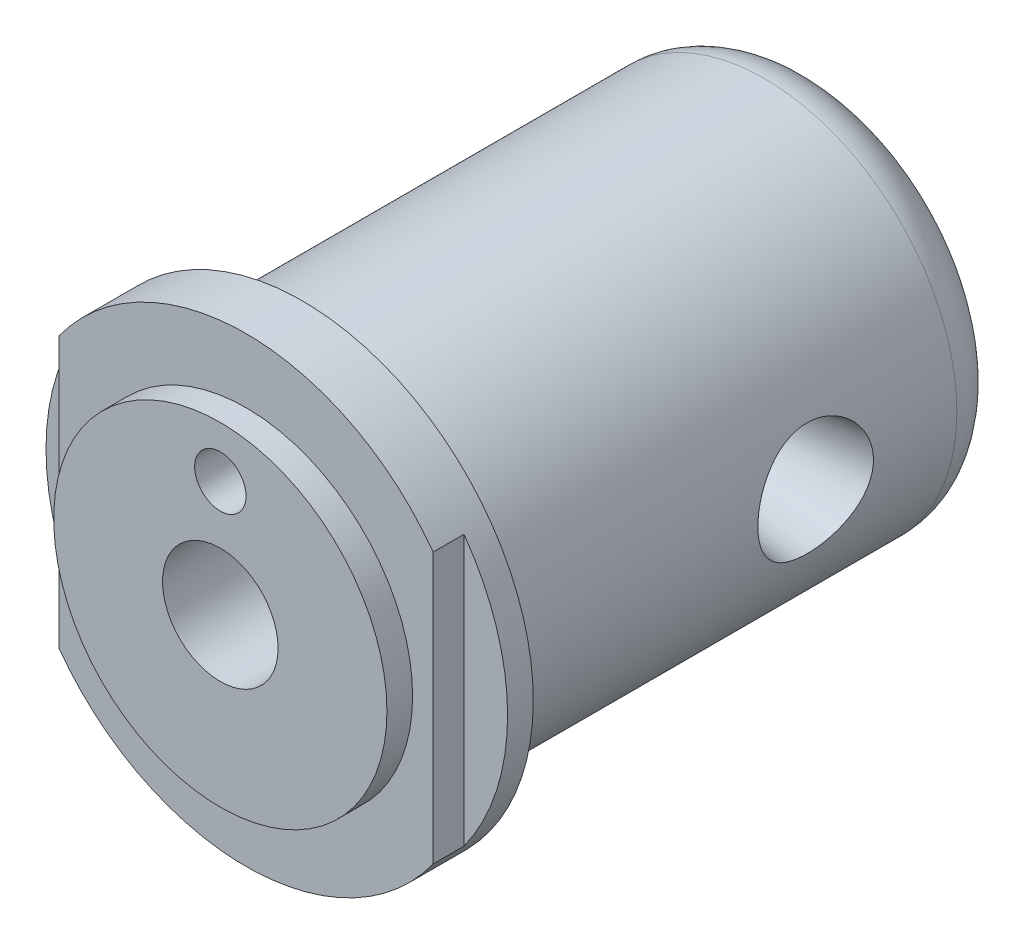
ISO-10303-21;
HEADER;
FILE_DESCRIPTION(('STEP AP214'),'2;1');
FILE_NAME('part.step','',(''),(''),'','','');
FILE_SCHEMA(('AUTOMOTIVE_DESIGN { 1 0 10303 214 1 1 1 1 }'));
ENDSEC;
DATA;
#1=APPLICATION_CONTEXT('core data for automotive mechanical design processes');
#2=APPLICATION_PROTOCOL_DEFINITION('international standard','automotive_design',2000,#1);
#3=PRODUCT_CONTEXT('',#1,'mechanical');
#4=PRODUCT('Part','Part','',(#3));
#5=PRODUCT_RELATED_PRODUCT_CATEGORY('part','',(#4));
#6=PRODUCT_DEFINITION_FORMATION('','',#4);
#7=PRODUCT_DEFINITION_CONTEXT('part definition',#1,'design');
#8=PRODUCT_DEFINITION('design','',#6,#7);
#9=PRODUCT_DEFINITION_SHAPE('','',#8);
#10=(LENGTH_UNIT() NAMED_UNIT(*) SI_UNIT(.MILLI.,.METRE.));
#11=(NAMED_UNIT(*) PLANE_ANGLE_UNIT() SI_UNIT($,.RADIAN.));
#12=(NAMED_UNIT(*) SI_UNIT($,.STERADIAN.) SOLID_ANGLE_UNIT());
#13=UNCERTAINTY_MEASURE_WITH_UNIT(LENGTH_MEASURE(1.E-05),#10,'distance_accuracy_value','');
#14=(GEOMETRIC_REPRESENTATION_CONTEXT(3) GLOBAL_UNCERTAINTY_ASSIGNED_CONTEXT((#13)) GLOBAL_UNIT_ASSIGNED_CONTEXT((#10,
#11,#12)) REPRESENTATION_CONTEXT('',''));
#15=CARTESIAN_POINT('',(0.,0.,0.));
#16=DIRECTION('',(0.,0.,1.));
#17=DIRECTION('',(1.,0.,0.));
#18=AXIS2_PLACEMENT_3D('',#15,#16,#17);
#19=CARTESIAN_POINT('',(0.,0.,1.));
#20=DIRECTION('',(0.,0.,-1.));
#21=DIRECTION('',(-1.,0.,0.));
#22=AXIS2_PLACEMENT_3D('',#19,#20,#21);
#23=CYLINDRICAL_SURFACE('',#22,6.49);
#24=CARTESIAN_POINT('',(0.,0.,1.));
#25=DIRECTION('',(0.,0.,1.));
#26=DIRECTION('',(1.,0.,0.));
#27=AXIS2_PLACEMENT_3D('',#24,#25,#26);
#28=CIRCLE('',#27,6.49);
#29=CARTESIAN_POINT('',(6.49,0.,1.));
#30=VERTEX_POINT('',#29);
#31=EDGE_CURVE('E117',#30,#30,#28,.T.);
#32=ORIENTED_EDGE('',*,*,#31,.F.);
#33=EDGE_LOOP('',(#32));
#34=FACE_BOUND('',#33,.T.);
#35=CARTESIAN_POINT('',(0.,0.,0.));
#36=DIRECTION('',(0.,0.,1.));
#37=DIRECTION('',(1.,0.,0.));
#38=AXIS2_PLACEMENT_3D('',#35,#36,#37);
#39=CIRCLE('',#38,6.49);
#40=CARTESIAN_POINT('',(6.49,0.,0.));
#41=VERTEX_POINT('',#40);
#42=EDGE_CURVE('E139',#41,#41,#39,.T.);
#43=ORIENTED_EDGE('',*,*,#42,.T.);
#44=EDGE_LOOP('',(#43));
#45=FACE_BOUND('',#44,.T.);
#46=ADVANCED_FACE('F41',(#34,#45),#23,.T.);
#47=CARTESIAN_POINT('',(0.,0.,1.));
#48=DIRECTION('',(0.,0.,1.));
#49=DIRECTION('',(1.,0.,0.));
#50=AXIS2_PLACEMENT_3D('',#47,#48,#49);
#51=PLANE('',#50);
#52=CARTESIAN_POINT('',(0.,0.,1.));
#53=DIRECTION('',(0.,0.,1.));
#54=DIRECTION('',(1.,0.,0.));
#55=AXIS2_PLACEMENT_3D('',#52,#53,#54);
#56=CIRCLE('',#55,2.24999999999999);
#57=CARTESIAN_POINT('',(2.24999999999999,0.,1.));
#58=VERTEX_POINT('',#57);
#59=EDGE_CURVE('E214',#58,#58,#56,.T.);
#60=ORIENTED_EDGE('',*,*,#59,.F.);
#61=EDGE_LOOP('',(#60));
#62=FACE_BOUND('',#61,.T.);
#63=CARTESIAN_POINT('',(0.,4.5,1.));
#64=DIRECTION('',(0.,0.,1.));
#65=DIRECTION('',(1.,0.,0.));
#66=AXIS2_PLACEMENT_3D('',#63,#64,#65);
#67=CIRCLE('',#66,0.999999999999998);
#68=CARTESIAN_POINT('',(0.999999999999998,4.5,1.));
#69=VERTEX_POINT('',#68);
#70=EDGE_CURVE('E102',#69,#69,#67,.T.);
#71=ORIENTED_EDGE('',*,*,#70,.F.);
#72=EDGE_LOOP('',(#71));
#73=FACE_BOUND('',#72,.T.);
#74=ORIENTED_EDGE('',*,*,#31,.T.);
#75=EDGE_LOOP('',(#74));
#76=FACE_BOUND('',#75,.T.);
#77=ADVANCED_FACE('F169',(#62,#73,#76),#51,.T.);
#78=CARTESIAN_POINT('',(7.29,0.,-1.2));
#79=DIRECTION('',(1.,0.,0.));
#80=DIRECTION('',(0.,0.,-1.));
#81=AXIS2_PLACEMENT_3D('',#78,#79,#80);
#82=PLANE('',#81);
#83=DIRECTION('',(0.,1.,0.));
#84=VECTOR('',#83,1.);
#85=CARTESIAN_POINT('',(7.29,0.,0.));
#86=LINE('',#85,#84);
#87=CARTESIAN_POINT('',(7.29,-5.26079841849125,0.));
#88=VERTEX_POINT('',#87);
#89=CARTESIAN_POINT('',(7.29,5.26079841849125,0.));
#90=VERTEX_POINT('',#89);
#91=EDGE_CURVE('E121',#88,#90,#86,.T.);
#92=ORIENTED_EDGE('',*,*,#91,.F.);
#93=DIRECTION('',(0.,0.,1.));
#94=VECTOR('',#93,1.);
#95=CARTESIAN_POINT('',(7.29,-5.26079841849125,-1.2));
#96=LINE('',#95,#94);
#97=CARTESIAN_POINT('',(7.29,-5.26079841849125,-1.2));
#98=VERTEX_POINT('',#97);
#99=EDGE_CURVE('E59',#98,#88,#96,.T.);
#100=ORIENTED_EDGE('',*,*,#99,.F.);
#101=DIRECTION('',(0.,1.,0.));
#102=VECTOR('',#101,1.);
#103=CARTESIAN_POINT('',(7.29,0.,-1.2));
#104=LINE('',#103,#102);
#105=CARTESIAN_POINT('',(7.29,5.26079841849125,-1.2));
#106=VERTEX_POINT('',#105);
#107=EDGE_CURVE('E125',#98,#106,#104,.T.);
#108=ORIENTED_EDGE('',*,*,#107,.T.);
#109=DIRECTION('',(0.,0.,1.));
#110=VECTOR('',#109,1.);
#111=CARTESIAN_POINT('',(7.29,5.26079841849125,-1.2));
#112=LINE('',#111,#110);
#113=EDGE_CURVE('E84',#106,#90,#112,.T.);
#114=ORIENTED_EDGE('',*,*,#113,.T.);
#115=EDGE_LOOP('',(#92,#100,#108,#114));
#116=FACE_BOUND('',#115,.T.);
#117=ADVANCED_FACE('F174',(#116),#82,.T.);
#118=CARTESIAN_POINT('',(0.,0.,-1.2));
#119=DIRECTION('',(0.,0.,1.));
#120=DIRECTION('',(1.,0.,0.));
#121=AXIS2_PLACEMENT_3D('',#118,#119,#120);
#122=CYLINDRICAL_SURFACE('',#121,8.99);
#123=CARTESIAN_POINT('',(0.,0.,0.));
#124=DIRECTION('',(0.,0.,1.));
#125=DIRECTION('',(1.,0.,0.));
#126=AXIS2_PLACEMENT_3D('',#123,#124,#125);
#127=CIRCLE('',#126,8.99);
#128=CARTESIAN_POINT('',(-7.29,-5.26079841849125,0.));
#129=VERTEX_POINT('',#128);
#130=EDGE_CURVE('E128',#129,#88,#127,.T.);
#131=ORIENTED_EDGE('',*,*,#130,.F.);
#132=DIRECTION('',(0.,0.,1.));
#133=VECTOR('',#132,1.);
#134=CARTESIAN_POINT('',(-7.29,-5.26079841849125,-1.2));
#135=LINE('',#134,#133);
#136=CARTESIAN_POINT('',(-7.29,-5.26079841849125,-1.2));
#137=VERTEX_POINT('',#136);
#138=EDGE_CURVE('E77',#137,#129,#135,.T.);
#139=ORIENTED_EDGE('',*,*,#138,.F.);
#140=CARTESIAN_POINT('',(0.,0.,-1.2));
#141=DIRECTION('',(0.,0.,-1.));
#142=DIRECTION('',(-1.,0.,0.));
#143=AXIS2_PLACEMENT_3D('',#140,#141,#142);
#144=CIRCLE('',#143,8.99);
#145=CARTESIAN_POINT('',(-7.29,5.26079841849125,-1.2));
#146=VERTEX_POINT('',#145);
#147=EDGE_CURVE('E113',#137,#146,#144,.T.);
#148=ORIENTED_EDGE('',*,*,#147,.T.);
#149=DIRECTION('',(0.,0.,1.));
#150=VECTOR('',#149,1.);
#151=CARTESIAN_POINT('',(-7.29,5.26079841849125,-1.2));
#152=LINE('',#151,#150);
#153=CARTESIAN_POINT('',(-7.29,5.26079841849125,0.));
#154=VERTEX_POINT('',#153);
#155=EDGE_CURVE('E141',#146,#154,#152,.T.);
#156=ORIENTED_EDGE('',*,*,#155,.T.);
#157=EDGE_CURVE('E133',#90,#154,#127,.T.);
#158=ORIENTED_EDGE('',*,*,#157,.F.);
#159=ORIENTED_EDGE('',*,*,#113,.F.);
#160=EDGE_CURVE('E122',#106,#98,#144,.T.);
#161=ORIENTED_EDGE('',*,*,#160,.T.);
#162=ORIENTED_EDGE('',*,*,#99,.T.);
#163=EDGE_LOOP('',(#131,#139,#148,#156,#158,#159,#161,#162));
#164=FACE_BOUND('',#163,.T.);
#165=CARTESIAN_POINT('',(0.,0.,-2.2));
#166=DIRECTION('',(0.,0.,-1.));
#167=DIRECTION('',(-1.,0.,0.));
#168=AXIS2_PLACEMENT_3D('',#165,#166,#167);
#169=CIRCLE('',#168,8.99);
#170=CARTESIAN_POINT('',(-8.99,0.,-2.2));
#171=VERTEX_POINT('',#170);
#172=EDGE_CURVE('E118',#171,#171,#169,.T.);
#173=ORIENTED_EDGE('',*,*,#172,.F.);
#174=EDGE_LOOP('',(#173));
#175=FACE_BOUND('',#174,.T.);
#176=ADVANCED_FACE('F182',(#164,#175),#122,.T.);
#177=CARTESIAN_POINT('',(-7.29,0.,-1.2));
#178=DIRECTION('',(1.,0.,0.));
#179=DIRECTION('',(0.,0.,-1.));
#180=AXIS2_PLACEMENT_3D('',#177,#178,#179);
#181=PLANE('',#180);
#182=DIRECTION('',(0.,1.,0.));
#183=VECTOR('',#182,1.);
#184=CARTESIAN_POINT('',(-7.29,0.,0.));
#185=LINE('',#184,#183);
#186=EDGE_CURVE('E136',#129,#154,#185,.T.);
#187=ORIENTED_EDGE('',*,*,#186,.T.);
#188=ORIENTED_EDGE('',*,*,#155,.F.);
#189=DIRECTION('',(0.,1.,0.));
#190=VECTOR('',#189,1.);
#191=CARTESIAN_POINT('',(-7.29,0.,-1.2));
#192=LINE('',#191,#190);
#193=EDGE_CURVE('E127',#137,#146,#192,.T.);
#194=ORIENTED_EDGE('',*,*,#193,.F.);
#195=ORIENTED_EDGE('',*,*,#138,.T.);
#196=EDGE_LOOP('',(#187,#188,#194,#195));
#197=FACE_BOUND('',#196,.T.);
#198=ADVANCED_FACE('F183',(#197),#181,.F.);
#199=CARTESIAN_POINT('',(0.,0.,0.));
#200=DIRECTION('',(0.,0.,1.));
#201=DIRECTION('',(1.,0.,0.));
#202=AXIS2_PLACEMENT_3D('',#199,#200,#201);
#203=PLANE('',#202);
#204=ORIENTED_EDGE('',*,*,#42,.F.);
#205=EDGE_LOOP('',(#204));
#206=FACE_BOUND('',#205,.T.);
#207=ORIENTED_EDGE('',*,*,#91,.T.);
#208=ORIENTED_EDGE('',*,*,#157,.T.);
#209=ORIENTED_EDGE('',*,*,#186,.F.);
#210=ORIENTED_EDGE('',*,*,#130,.T.);
#211=EDGE_LOOP('',(#207,#208,#209,#210));
#212=FACE_BOUND('',#211,.T.);
#213=ADVANCED_FACE('F186',(#206,#212),#203,.T.);
#214=CARTESIAN_POINT('',(0.,0.,-1.2));
#215=DIRECTION('',(0.,0.,-1.));
#216=DIRECTION('',(-1.,0.,0.));
#217=AXIS2_PLACEMENT_3D('',#214,#215,#216);
#218=PLANE('',#217);
#219=ORIENTED_EDGE('',*,*,#147,.F.);
#220=ORIENTED_EDGE('',*,*,#193,.T.);
#221=EDGE_LOOP('',(#219,#220));
#222=FACE_BOUND('',#221,.T.);
#223=ADVANCED_FACE('F190',(#222),#218,.F.);
#224=CARTESIAN_POINT('',(0.,0.,-2.2));
#225=DIRECTION('',(0.,0.,-1.));
#226=DIRECTION('',(-1.,0.,0.));
#227=AXIS2_PLACEMENT_3D('',#224,#225,#226);
#228=PLANE('',#227);
#229=CARTESIAN_POINT('',(0.,0.,-2.2));
#230=DIRECTION('',(0.,0.,-1.));
#231=DIRECTION('',(-1.,0.,0.));
#232=AXIS2_PLACEMENT_3D('',#229,#230,#231);
#233=CIRCLE('',#232,7.49);
#234=CARTESIAN_POINT('',(-7.49,0.,-2.2));
#235=VERTEX_POINT('',#234);
#236=EDGE_CURVE('E114',#235,#235,#233,.T.);
#237=ORIENTED_EDGE('',*,*,#236,.F.);
#238=EDGE_LOOP('',(#237));
#239=FACE_BOUND('',#238,.T.);
#240=ORIENTED_EDGE('',*,*,#172,.T.);
#241=EDGE_LOOP('',(#240));
#242=FACE_BOUND('',#241,.T.);
#243=ADVANCED_FACE('F196',(#239,#242),#228,.T.);
#244=ORIENTED_EDGE('',*,*,#107,.F.);
#245=ORIENTED_EDGE('',*,*,#160,.F.);
#246=EDGE_LOOP('',(#244,#245));
#247=FACE_BOUND('',#246,.T.);
#248=ADVANCED_FACE('F192',(#247),#218,.F.);
#249=CARTESIAN_POINT('',(0.,0.,-22.2));
#250=DIRECTION('',(0.,0.,1.));
#251=DIRECTION('',(1.,0.,0.));
#252=AXIS2_PLACEMENT_3D('',#249,#250,#251);
#253=CYLINDRICAL_SURFACE('',#252,7.49);
#254=CARTESIAN_POINT('',(7.3128368733588,-1.61941868077528,-16.2305450955995));
#255=CARTESIAN_POINT('',(7.29402382098097,-1.70437549146422,-16.1372885571516));
#256=CARTESIAN_POINT('',(7.27539896323543,-1.78146133897602,-16.0367799917681));
#257=CARTESIAN_POINT('',(7.24062847937731,-1.91790986657949,-15.8239475667205));
#258=CARTESIAN_POINT('',(7.22448379893655,-1.97726579450087,-15.7116192276415));
#259=CARTESIAN_POINT('',(7.19655358841649,-2.07663118266049,-15.4780572335251));
#260=CARTESIAN_POINT('',(7.18477200184672,-2.11662315109466,-15.356815640416));
#261=CARTESIAN_POINT('',(7.16704183607154,-2.17590985396206,-15.1089824759983));
#262=CARTESIAN_POINT('',(7.161091443043,-2.1952110245513,-14.9823925810953));
#263=CARTESIAN_POINT('',(7.15583562586421,-2.21228252254799,-14.7304990136004));
#264=CARTESIAN_POINT('',(7.15638380008867,-2.2105272058738,-14.6052304195436));
#265=CARTESIAN_POINT('',(7.16370240687543,-2.18669134965924,-14.3568319612548));
#266=CARTESIAN_POINT('',(7.17047283387594,-2.16461082828666,-14.2337020951112));
#267=CARTESIAN_POINT('',(7.18931556131941,-2.10116901304241,-13.9943118420954));
#268=CARTESIAN_POINT('',(7.20133321554131,-2.06000618237027,-13.8779943070167));
#269=CARTESIAN_POINT('',(7.2292838111022,-1.95965701685164,-13.6539167442225));
#270=CARTESIAN_POINT('',(7.24521742851835,-1.90046756935109,-13.5461581984414));
#271=CARTESIAN_POINT('',(7.2796996458539,-1.76384497964604,-13.3392739854779));
#272=CARTESIAN_POINT('',(7.29830496353565,-1.68598175780515,-13.240441646459));
#273=CARTESIAN_POINT('',(7.33574265957226,-1.51480723272835,-13.0572276668046));
#274=CARTESIAN_POINT('',(7.35457506655867,-1.42149396225469,-12.9728478691825));
#275=CARTESIAN_POINT('',(7.39059971581435,-1.22051694390766,-12.8200597362314));
#276=CARTESIAN_POINT('',(7.40777029623074,-1.11269868967476,-12.7518489030096));
#277=CARTESIAN_POINT('',(7.43823423500196,-0.886438493892254,-12.6349668199201));
#278=CARTESIAN_POINT('',(7.45152867367914,-0.767999524506454,-12.586290124252));
#279=CARTESIAN_POINT('',(7.47226388226268,-0.528471235221997,-12.5117195659088));
#280=CARTESIAN_POINT('',(7.47990213974171,-0.407640021242617,-12.4850529139284));
#281=CARTESIAN_POINT('',(7.4892254408857,-0.162990759498875,-12.4526194856404));
#282=CARTESIAN_POINT('',(7.49091230046256,-0.0391736344182005,-12.446846334219));
#283=CARTESIAN_POINT('',(7.48820216439449,0.202138435118817,-12.4562110992096));
#284=CARTESIAN_POINT('',(7.48406842011473,0.319672744198329,-12.4704441359517));
#285=CARTESIAN_POINT('',(7.47063128893109,0.550589637937632,-12.517674783312));
#286=CARTESIAN_POINT('',(7.46132782986845,0.663972164623388,-12.5506726558495));
#287=CARTESIAN_POINT('',(7.43847739591045,0.883995704679985,-12.6344403286936));
#288=CARTESIAN_POINT('',(7.42491406964745,0.990608805496302,-12.6852786989473));
#289=CARTESIAN_POINT('',(7.39492641322139,1.1940486210566,-12.8031138814629));
#290=CARTESIAN_POINT('',(7.37850143404131,1.29087310787387,-12.8701143605865));
#291=CARTESIAN_POINT('',(7.34361368575338,1.4767513567701,-13.0218509187984));
#292=CARTESIAN_POINT('',(7.32509201912862,1.56524547829928,-13.1072591902897));
#293=CARTESIAN_POINT('',(7.2886238864278,1.72712561867442,-13.2914829166485));
#294=CARTESIAN_POINT('',(7.27067755321655,1.80050816864484,-13.3903014412349));
#295=CARTESIAN_POINT('',(7.23670057893441,1.93263877706465,-13.6024754972862));
#296=CARTESIAN_POINT('',(7.22075734840077,1.99079486094635,-13.7162148352412));
#297=CARTESIAN_POINT('',(7.19343319113006,2.08738011182012,-13.952294087962));
#298=CARTESIAN_POINT('',(7.1820516564525,2.12581190767393,-14.0746328541198));
#299=CARTESIAN_POINT('',(7.1653703224353,2.18137771449332,-14.3228125320783));
#300=CARTESIAN_POINT('',(7.15999445216776,2.19877835430832,-14.4485884698976));
#301=CARTESIAN_POINT('',(7.1557420634832,2.2125806214253,-14.7013864670269));
#302=CARTESIAN_POINT('',(7.1568645282216,2.20898553408981,-14.8284083282725));
#303=CARTESIAN_POINT('',(7.16535528957068,2.1812787176417,-15.0767896066676));
#304=CARTESIAN_POINT('',(7.17256920721126,2.15767404506749,-15.1982114465172));
#305=CARTESIAN_POINT('',(7.19218210833241,2.09136345409887,-15.4352794234994));
#306=CARTESIAN_POINT('',(7.20458163867236,2.0486555210981,-15.5509249500389));
#307=CARTESIAN_POINT('',(7.23333298364232,1.94471666888204,-15.7747888620381));
#308=CARTESIAN_POINT('',(7.24973173012531,1.88326344554161,-15.8828978489275));
#309=CARTESIAN_POINT('',(7.28457634832744,1.74362071000219,-16.0873529692316));
#310=CARTESIAN_POINT('',(7.30302262692005,1.66542786852813,-16.1836967567185));
#311=CARTESIAN_POINT('',(7.34045128970055,1.49195648610732,-16.3644391373729));
#312=CARTESIAN_POINT('',(7.35943519982979,1.39628833746524,-16.4484643182251));
#313=CARTESIAN_POINT('',(7.39531801291602,1.19169497708043,-16.599027397161));
#314=CARTESIAN_POINT('',(7.41221708606998,1.08277084894186,-16.6655667232153));
#315=CARTESIAN_POINT('',(7.44174902601413,0.856325415187558,-16.7780546681325));
#316=CARTESIAN_POINT('',(7.4544435539097,0.738962240639739,-16.8243044515131));
#317=CARTESIAN_POINT('',(7.47443147700809,0.497601683290598,-16.895933142201));
#318=CARTESIAN_POINT('',(7.48172695409961,0.373606877461778,-16.9213200946905));
#319=CARTESIAN_POINT('',(7.48983831852553,0.129056232023786,-16.9494793586946));
#320=CARTESIAN_POINT('',(7.49095473246435,0.00863041669633843,-16.9533007298952));
#321=CARTESIAN_POINT('',(7.48739312919513,-0.231105889521319,-16.9409933183472));
#322=CARTESIAN_POINT('',(7.48271553303914,-0.350416460821769,-16.9248659852758));
#323=CARTESIAN_POINT('',(7.46824329788886,-0.581911549856151,-16.873848729452));
#324=CARTESIAN_POINT('',(7.45856029069625,-0.69419391994356,-16.8393676566705));
#325=CARTESIAN_POINT('',(7.43514390592942,-0.911413537014495,-16.7530987813898));
#326=CARTESIAN_POINT('',(7.4214110262673,-1.01635168497315,-16.701313106303));
#327=CARTESIAN_POINT('',(7.39224137474299,-1.2098880465329,-16.5859103390277));
#328=CARTESIAN_POINT('',(7.37697364293625,-1.29910519693162,-16.5232824966313));
#329=CARTESIAN_POINT('',(7.34536988740106,-1.46730059005963,-16.3857449679223));
#330=CARTESIAN_POINT('',(7.32903363505655,-1.54627663079346,-16.3108326480744));
#331=CARTESIAN_POINT('',(7.3128368733588,-1.61941868077528,-16.2305450955995));
#332=B_SPLINE_CURVE_WITH_KNOTS('',3,(#254,#255,#256,#257,#258,#259,#260,#261,#262,#263,#264,
#265,#266,#267,#268,#269,#270,#271,#272,#273,#274,#275,#276,#277,#278,#279,#280,#281,#282,#283,
#284,#285,#286,#287,#288,#289,#290,#291,#292,#293,#294,#295,#296,#297,#298,#299,#300,#301,#302,
#303,#304,#305,#306,#307,#308,#309,#310,#311,#312,#313,#314,#315,#316,#317,#318,#319,#320,#321,
#322,#323,#324,#325,#326,#327,#328,#329,#330,#331),.UNSPECIFIED.,.T.,.F.,(4,2,2,2,2,2,2,2,2,2,2,
2,2,2,2,2,2,2,2,2,2,2,2,2,2,2,2,2,2,2,2,2,2,2,2,2,2,2,4),(0.,0.382254852726517,
0.764655096341131,1.14740012733652,1.53002606567025,1.90404878749443,2.27807117499683,
2.64828797325102,3.01856873307923,3.39837327769684,3.77822621965342,4.16250407428808,
4.54667472394867,4.91670187126981,5.28661610480996,5.64032718227863,5.99404319696278,
6.34913388408137,6.70430521012564,7.07575700712948,7.44729397642938,7.83164408630134,
8.21594295651083,8.59531686324905,8.97463140803184,9.34461167053002,9.71463095989453,
10.0892212407831,10.463886091748,10.8482415614737,11.2325656333087,11.6109742630662,
11.9892369012871,12.3489290258756,12.7085950130876,13.0605651673276,13.4124920665781,
13.741516931632,14.0706124251796),.UNSPECIFIED.);
#333=CARTESIAN_POINT('',(7.3128368733588,-1.61941868077528,-16.2305450955995));
#334=VERTEX_POINT('',#333);
#335=EDGE_CURVE('E207',#334,#334,#332,.T.);
#336=ORIENTED_EDGE('',*,*,#335,.T.);
#337=EDGE_LOOP('',(#336));
#338=FACE_BOUND('',#337,.T.);
#339=CARTESIAN_POINT('',(0.,0.,-20.2));
#340=DIRECTION('',(0.,0.,-1.));
#341=DIRECTION('',(-1.,0.,0.));
#342=AXIS2_PLACEMENT_3D('',#339,#340,#341);
#343=CIRCLE('',#342,7.49);
#344=CARTESIAN_POINT('',(-7.49,0.,-20.2));
#345=VERTEX_POINT('',#344);
#346=EDGE_CURVE('E11',#345,#345,#343,.F.);
#347=ORIENTED_EDGE('',*,*,#346,.T.);
#348=EDGE_LOOP('',(#347));
#349=FACE_BOUND('',#348,.T.);
#350=ORIENTED_EDGE('',*,*,#236,.T.);
#351=EDGE_LOOP('',(#350));
#352=FACE_BOUND('',#351,.T.);
#353=ADVANCED_FACE('F195',(#338,#349,#352),#253,.T.);
#354=CARTESIAN_POINT('',(0.,0.,-22.2));
#355=DIRECTION('',(0.,0.,-1.));
#356=DIRECTION('',(-1.,0.,0.));
#357=AXIS2_PLACEMENT_3D('',#354,#355,#356);
#358=PLANE('',#357);
#359=CARTESIAN_POINT('',(0.,0.,-22.2));
#360=DIRECTION('',(0.,0.,-1.));
#361=DIRECTION('',(-1.,0.,0.));
#362=AXIS2_PLACEMENT_3D('',#359,#360,#361);
#363=CIRCLE('',#362,5.49);
#364=CARTESIAN_POINT('',(-5.49,0.,-22.2));
#365=VERTEX_POINT('',#364);
#366=EDGE_CURVE('E51',#365,#365,#363,.T.);
#367=ORIENTED_EDGE('',*,*,#366,.T.);
#368=EDGE_LOOP('',(#367));
#369=FACE_BOUND('',#368,.T.);
#370=CARTESIAN_POINT('',(0.,0.,-22.2));
#371=DIRECTION('',(0.,0.,-1.));
#372=DIRECTION('',(-1.,0.,0.));
#373=AXIS2_PLACEMENT_3D('',#370,#371,#372);
#374=CIRCLE('',#373,3.5);
#375=CARTESIAN_POINT('',(-3.5,0.,-22.2));
#376=VERTEX_POINT('',#375);
#377=EDGE_CURVE('E101',#376,#376,#374,.T.);
#378=ORIENTED_EDGE('',*,*,#377,.F.);
#379=EDGE_LOOP('',(#378));
#380=FACE_BOUND('',#379,.T.);
#381=ADVANCED_FACE('F151',(#369,#380),#358,.T.);
#382=CARTESIAN_POINT('',(0.,0.,-5.5));
#383=DIRECTION('',(0.,0.,1.));
#384=DIRECTION('',(1.,0.,0.));
#385=AXIS2_PLACEMENT_3D('',#382,#383,#384);
#386=PLANE('',#385);
#387=CARTESIAN_POINT('',(0.,0.,-5.5));
#388=DIRECTION('',(0.,0.,1.));
#389=DIRECTION('',(1.,0.,0.));
#390=AXIS2_PLACEMENT_3D('',#387,#388,#389);
#391=CIRCLE('',#390,2.24999999999999);
#392=CARTESIAN_POINT('',(2.24999999999999,0.,-5.5));
#393=VERTEX_POINT('',#392);
#394=EDGE_CURVE('E45',#393,#393,#391,.T.);
#395=ORIENTED_EDGE('',*,*,#394,.T.);
#396=EDGE_LOOP('',(#395));
#397=FACE_BOUND('',#396,.T.);
#398=CARTESIAN_POINT('',(0.,0.,-5.5));
#399=DIRECTION('',(0.,0.,-1.));
#400=DIRECTION('',(-1.,0.,0.));
#401=AXIS2_PLACEMENT_3D('',#398,#399,#400);
#402=CIRCLE('',#401,3.5);
#403=CARTESIAN_POINT('',(-3.5,0.,-5.5));
#404=VERTEX_POINT('',#403);
#405=EDGE_CURVE('E105',#404,#404,#402,.T.);
#406=ORIENTED_EDGE('',*,*,#405,.T.);
#407=EDGE_LOOP('',(#406));
#408=FACE_BOUND('',#407,.T.);
#409=ADVANCED_FACE('F227',(#397,#408),#386,.F.);
#410=CARTESIAN_POINT('',(0.,0.,-22.2));
#411=DIRECTION('',(0.,0.,-1.));
#412=DIRECTION('',(-1.,0.,0.));
#413=AXIS2_PLACEMENT_3D('',#410,#411,#412);
#414=CYLINDRICAL_SURFACE('',#413,3.5);
#415=CARTESIAN_POINT('',(3.26652565150748,-1.25690499563181,-15.8908038888006));
#416=CARTESIAN_POINT('',(3.2414792888779,-1.32199465973515,-15.8176262201337));
#417=CARTESIAN_POINT('',(3.21655720933328,-1.38094743654719,-15.7388787226882));
#418=CARTESIAN_POINT('',(3.16969203037423,-1.48537786147623,-15.5718710684038));
#419=CARTESIAN_POINT('',(3.14775510389414,-1.53082781016917,-15.4835918570292));
#420=CARTESIAN_POINT('',(3.10959417526779,-1.60693892509941,-15.2993087333518));
#421=CARTESIAN_POINT('',(3.09338882505665,-1.63755192584515,-15.2032808275408));
#422=CARTESIAN_POINT('',(3.06920084623526,-1.68246140038252,-15.0065637668673));
#423=CARTESIAN_POINT('',(3.06120666048062,-1.69678081033584,-14.9058813724592));
#424=CARTESIAN_POINT('',(3.05497386853527,-1.70797132448764,-14.7112561766031));
#425=CARTESIAN_POINT('',(3.05601481363582,-1.70613085090157,-14.6174089280797));
#426=CARTESIAN_POINT('',(3.0659903031195,-1.68813686826053,-14.4315216938812));
#427=CARTESIAN_POINT('',(3.07492617137804,-1.67198095869278,-14.3394820139578));
#428=CARTESIAN_POINT('',(3.09904934019789,-1.62681094336493,-14.1628130071526));
#429=CARTESIAN_POINT('',(3.11402088887926,-1.59823818898216,-14.0780394239805));
#430=CARTESIAN_POINT('',(3.14846928379523,-1.5292555094329,-13.9144426954739));
#431=CARTESIAN_POINT('',(3.1679476482451,-1.48884159409878,-13.8356215672434));
#432=CARTESIAN_POINT('',(3.21126839275143,-1.39310579833004,-13.6788349690989));
#433=CARTESIAN_POINT('',(3.23534278519295,-1.3367946314806,-13.60153719149));
#434=CARTESIAN_POINT('',(3.28399442846431,-1.21237038802659,-13.4572249302594));
#435=CARTESIAN_POINT('',(3.30857194170279,-1.14425100687041,-13.3902159761932));
#436=CARTESIAN_POINT('',(3.3570901922289,-0.993262970618865,-13.2647173030573));
#437=CARTESIAN_POINT('',(3.38091816212788,-0.909781909560507,-13.2069149565451));
#438=CARTESIAN_POINT('',(3.42362479147823,-0.732836496115768,-13.1068122000166));
#439=CARTESIAN_POINT('',(3.44250679807958,-0.639378955849419,-13.0645012985078));
#440=CARTESIAN_POINT('',(3.47181986203146,-0.452473176705447,-12.9999881959813));
#441=CARTESIAN_POINT('',(3.4827777230061,-0.359547931423788,-12.976517816039));
#442=CARTESIAN_POINT('',(3.49712590253958,-0.170494917518214,-12.9459327498095));
#443=CARTESIAN_POINT('',(3.50052223320722,-0.0743697548908714,-12.9388050694453));
#444=CARTESIAN_POINT('',(3.49940545995013,0.107629181504066,-12.9411681154748));
#445=CARTESIAN_POINT('',(3.49567433779507,0.193534608318401,-12.9490157415823));
#446=CARTESIAN_POINT('',(3.48219640389649,0.362630756347022,-12.9777696781793));
#447=CARTESIAN_POINT('',(3.47244953051587,0.445821449737075,-12.9986761224688));
#448=CARTESIAN_POINT('',(3.4479137836092,0.60706582255574,-13.0525414193901));
#449=CARTESIAN_POINT('',(3.43314151744887,0.685135424685075,-13.0854605993693));
#450=CARTESIAN_POINT('',(3.39984214188443,0.83484296881015,-13.1621798040264));
#451=CARTESIAN_POINT('',(3.38131389509241,0.906478953069664,-13.2059831255546));
#452=CARTESIAN_POINT('',(3.34014456737984,1.04852495409445,-13.3078311557105));
#453=CARTESIAN_POINT('',(3.317280633062,1.11818762604242,-13.3668271519956));
#454=CARTESIAN_POINT('',(3.27092483306881,1.24730360195086,-13.4949264595747));
#455=CARTESIAN_POINT('',(3.24743254079561,1.30674975549558,-13.5640367876324));
#456=CARTESIAN_POINT('',(3.19982887719362,1.41957592903083,-13.7180214682947));
#457=CARTESIAN_POINT('',(3.17587267400627,1.47183431360145,-13.803771004711));
#458=CARTESIAN_POINT('',(3.13274539317788,1.56153643194911,-13.9838187548901));
#459=CARTESIAN_POINT('',(3.11357308040495,1.59898399113272,-14.0781147534901));
#460=CARTESIAN_POINT('',(3.08301239811094,1.65713767503633,-14.2709050177199));
#461=CARTESIAN_POINT('',(3.07147762301639,1.67816016438623,-14.3692794158211));
#462=CARTESIAN_POINT('',(3.05741632162932,1.70365280935688,-14.5687492952199));
#463=CARTESIAN_POINT('',(3.05488235184027,1.70813664225311,-14.6698424583989));
#464=CARTESIAN_POINT('',(3.05901145692202,1.70072033600281,-14.8616422223683));
#465=CARTESIAN_POINT('',(3.06483095814021,1.69032324016561,-14.9524304732035));
#466=CARTESIAN_POINT('',(3.08337675604979,1.65624842358165,-15.1307449088105));
#467=CARTESIAN_POINT('',(3.09610475019988,1.63256743885476,-15.2182702862238));
#468=CARTESIAN_POINT('',(3.12703620363732,1.57250924979013,-15.3886641014959));
#469=CARTESIAN_POINT('',(3.14528641738444,1.53602319068145,-15.4714853035391));
#470=CARTESIAN_POINT('',(3.18523173775164,1.45137365009615,-15.6300278880525));
#471=CARTESIAN_POINT('',(3.20692834043536,1.40320509248726,-15.7057461643615));
#472=CARTESIAN_POINT('',(3.25385487354419,1.29092014281385,-15.8556618156194));
#473=CARTESIAN_POINT('',(3.27922341956056,1.22571028451154,-15.9289998574225));
#474=CARTESIAN_POINT('',(3.32889751362879,1.08356183772823,-16.063774776738));
#475=CARTESIAN_POINT('',(3.35320271475233,1.00661945756587,-16.1252077921916));
#476=CARTESIAN_POINT('',(3.39855333597949,0.841025565818601,-16.23523263411));
#477=CARTESIAN_POINT('',(3.41953361427817,0.752191280801465,-16.2835785480518));
#478=CARTESIAN_POINT('',(3.45518943955716,0.566210404032664,-16.3637926904833));
#479=CARTESIAN_POINT('',(3.46987113455564,0.469072029474066,-16.3956769932907));
#480=CARTESIAN_POINT('',(3.48996524517221,0.27977860031563,-16.4388963324631));
#481=CARTESIAN_POINT('',(3.49616144121444,0.188105010794907,-16.4519756645553));
#482=CARTESIAN_POINT('',(3.50121076390572,0.00368196053791389,-16.4626520416818));
#483=CARTESIAN_POINT('',(3.50006808905038,-0.0890668547596618,-16.4602579389107));
#484=CARTESIAN_POINT('',(3.49097838876087,-0.264942104600111,-16.4409783756129));
#485=CARTESIAN_POINT('',(3.48359644333839,-0.348234378408197,-16.4252961120711));
#486=CARTESIAN_POINT('',(3.4634805604747,-0.510905369696746,-16.3817309801988));
#487=CARTESIAN_POINT('',(3.45074402253111,-0.590282164635254,-16.3538421833933));
#488=CARTESIAN_POINT('',(3.42056118886765,-0.74582102238064,-16.2858333580463));
#489=CARTESIAN_POINT('',(3.40297403184614,-0.821792063193706,-16.2453419241996));
#490=CARTESIAN_POINT('',(3.36484198998766,-0.966130277424786,-16.15384084182));
#491=CARTESIAN_POINT('',(3.34430052689525,-1.03450608762904,-16.102843332515));
#492=CARTESIAN_POINT('',(3.30455670590515,-1.1547325458911,-15.9985118278399));
#493=CARTESIAN_POINT('',(3.28550549434528,-1.20758080379934,-15.9462570765978));
#494=CARTESIAN_POINT('',(3.26652565150748,-1.25690499563181,-15.8908038888006));
#495=B_SPLINE_CURVE_WITH_KNOTS('',3,(#415,#416,#417,#418,#419,#420,#421,#422,#423,#424,#425,
#426,#427,#428,#429,#430,#431,#432,#433,#434,#435,#436,#437,#438,#439,#440,#441,#442,#443,#444,
#445,#446,#447,#448,#449,#450,#451,#452,#453,#454,#455,#456,#457,#458,#459,#460,#461,#462,#463,
#464,#465,#466,#467,#468,#469,#470,#471,#472,#473,#474,#475,#476,#477,#478,#479,#480,#481,#482,
#483,#484,#485,#486,#487,#488,#489,#490,#491,#492,#493,#494),.UNSPECIFIED.,.T.,.F.,(4,2,2,2,2,2,
2,2,2,2,2,2,2,2,2,2,2,2,2,2,2,2,2,2,2,2,2,2,2,2,2,2,2,2,2,2,2,2,2,4),(0.,0.303016578407139,
0.606650533483265,0.911263687132155,1.21544751039662,1.49561336043644,1.77582619954494,
2.04680334279991,2.31787190362882,2.61246108283544,2.90720803403517,3.2184636712724,
3.52950812077871,3.81726885030815,4.10480070188361,4.36258347498345,4.62036888935785,
4.87731054755558,5.13433012949642,5.4154943002109,5.69685445990735,6.00508703249086,
6.3132399413085,6.61530020354453,6.91711060939761,7.19050094243913,7.46395847957558,
7.73979932864404,8.01576024801068,8.31847869133674,8.62129517446597,8.92945894615833,
9.2373212324202,9.51421866804498,9.79095770749554,10.0450263144757,10.2992184547882,
10.5617535908653,10.8239870656025,11.053609511004),.UNSPECIFIED.);
#496=CARTESIAN_POINT('',(3.26652565150748,-1.25690499563181,-15.8908038888006));
#497=VERTEX_POINT('',#496);
#498=EDGE_CURVE('E215',#497,#497,#495,.T.);
#499=ORIENTED_EDGE('',*,*,#498,.F.);
#500=EDGE_LOOP('',(#499));
#501=FACE_BOUND('',#500,.T.);
#502=ORIENTED_EDGE('',*,*,#405,.F.);
#503=EDGE_LOOP('',(#502));
#504=FACE_BOUND('',#503,.T.);
#505=ORIENTED_EDGE('',*,*,#377,.T.);
#506=EDGE_LOOP('',(#505));
#507=FACE_BOUND('',#506,.T.);
#508=ADVANCED_FACE('F95',(#501,#504,#507),#414,.F.);
#509=CARTESIAN_POINT('',(0.,4.5,-3.));
#510=DIRECTION('',(0.,0.,1.));
#511=DIRECTION('',(1.,0.,0.));
#512=AXIS2_PLACEMENT_3D('',#509,#510,#511);
#513=CONICAL_SURFACE('',#512,0.999999999999999,1.02974425867665);
#514=CARTESIAN_POINT('',(0.,4.5,-3.60086061902756));
#515=VERTEX_POINT('',#514);
#516=VERTEX_LOOP('',#515);
#517=FACE_BOUND('',#516,.T.);
#518=CARTESIAN_POINT('',(0.,4.5,-3.));
#519=DIRECTION('',(0.,0.,1.));
#520=DIRECTION('',(1.,0.,0.));
#521=AXIS2_PLACEMENT_3D('',#518,#519,#520);
#522=CIRCLE('',#521,0.999999999999999);
#523=CARTESIAN_POINT('',(0.999999999999999,4.5,-3.));
#524=VERTEX_POINT('',#523);
#525=EDGE_CURVE('E99',#524,#524,#522,.T.);
#526=ORIENTED_EDGE('',*,*,#525,.T.);
#527=EDGE_LOOP('',(#526));
#528=FACE_BOUND('',#527,.T.);
#529=ADVANCED_FACE('F91',(#517,#528),#513,.F.);
#530=CARTESIAN_POINT('',(0.,4.5,1.));
#531=DIRECTION('',(0.,0.,1.));
#532=DIRECTION('',(1.,0.,0.));
#533=AXIS2_PLACEMENT_3D('',#530,#531,#532);
#534=CYLINDRICAL_SURFACE('',#533,0.999999999999998);
#535=ORIENTED_EDGE('',*,*,#525,.F.);
#536=EDGE_LOOP('',(#535));
#537=FACE_BOUND('',#536,.T.);
#538=ORIENTED_EDGE('',*,*,#70,.T.);
#539=EDGE_LOOP('',(#538));
#540=FACE_BOUND('',#539,.T.);
#541=ADVANCED_FACE('F94',(#537,#540),#534,.F.);
#542=CARTESIAN_POINT('',(0.,0.,-20.2));
#543=DIRECTION('',(0.,0.,-1.));
#544=DIRECTION('',(-1.,0.,0.));
#545=AXIS2_PLACEMENT_3D('',#542,#543,#544);
#546=TOROIDAL_SURFACE('',#545,5.49,2.);
#547=ORIENTED_EDGE('',*,*,#346,.F.);
#548=EDGE_LOOP('',(#547));
#549=FACE_BOUND('',#548,.T.);
#550=ORIENTED_EDGE('',*,*,#366,.F.);
#551=EDGE_LOOP('',(#550));
#552=FACE_BOUND('',#551,.T.);
#553=ADVANCED_FACE('F43',(#549,#552),#546,.T.);
#554=CARTESIAN_POINT('',(0.,0.,1.));
#555=DIRECTION('',(0.,0.,1.));
#556=DIRECTION('',(1.,0.,0.));
#557=AXIS2_PLACEMENT_3D('',#554,#555,#556);
#558=CYLINDRICAL_SURFACE('',#557,2.24999999999999);
#559=ORIENTED_EDGE('',*,*,#59,.T.);
#560=EDGE_LOOP('',(#559));
#561=FACE_BOUND('',#560,.T.);
#562=ORIENTED_EDGE('',*,*,#394,.F.);
#563=EDGE_LOOP('',(#562));
#564=FACE_BOUND('',#563,.T.);
#565=ADVANCED_FACE('F155',(#561,#564),#558,.F.);
#566=CARTESIAN_POINT('',(7.49,0.,-14.7));
#567=DIRECTION('',(1.,0.,0.));
#568=DIRECTION('',(0.,0.,-1.));
#569=AXIS2_PLACEMENT_3D('',#566,#567,#568);
#570=CONICAL_SURFACE('',#569,2.25,0.122173047639603);
#571=ORIENTED_EDGE('',*,*,#498,.T.);
#572=EDGE_LOOP('',(#571));
#573=FACE_BOUND('',#572,.T.);
#574=ORIENTED_EDGE('',*,*,#335,.F.);
#575=EDGE_LOOP('',(#574));
#576=FACE_BOUND('',#575,.T.);
#577=ADVANCED_FACE('F162',(#573,#576),#570,.F.);
#578=CLOSED_SHELL('',(#46,#77,#117,#176,#198,#213,#223,#243,#248,#353,#381,#409,#508,#529,#541,
#553,#565,#577));
#579=MANIFOLD_SOLID_BREP('B2',#578);
#580=ADVANCED_BREP_SHAPE_REPRESENTATION('',(#18,#579),#14);
#581=SHAPE_DEFINITION_REPRESENTATION(#9,#580);
ENDSEC;
END-ISO-10303-21;
